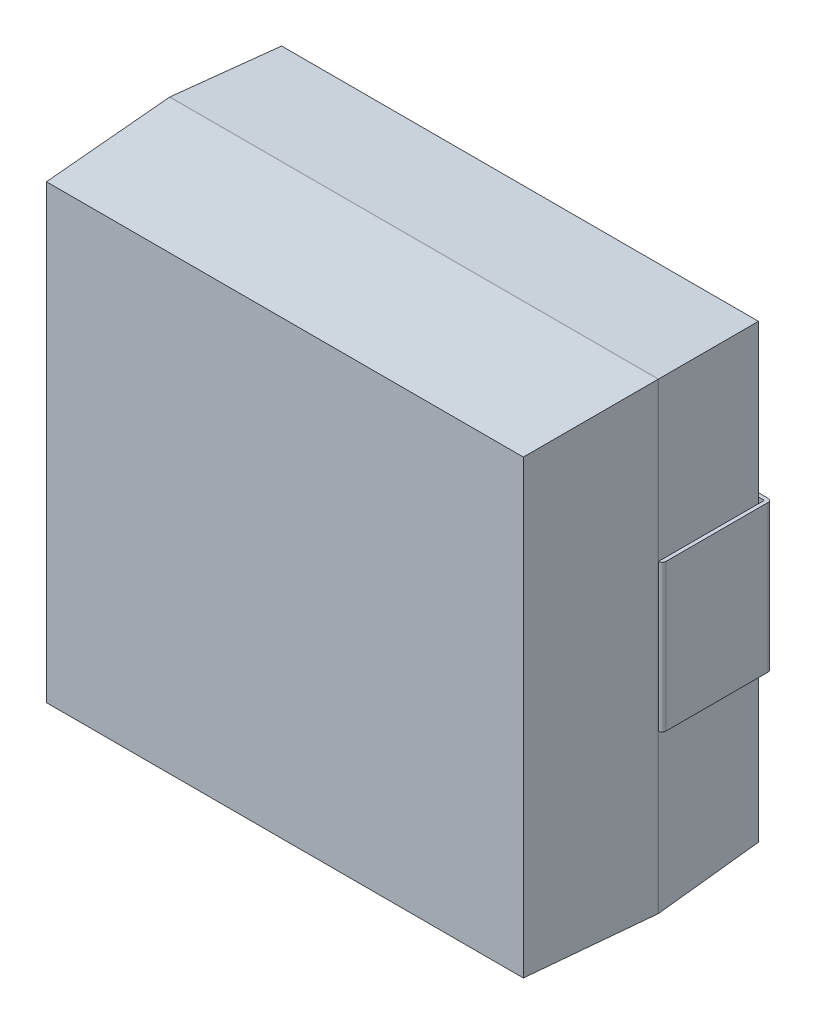
ISO-10303-21;
HEADER;
FILE_DESCRIPTION(('STEP AP214'),'2;1');
FILE_NAME('part.step','',(''),(''),'','','');
FILE_SCHEMA(('AUTOMOTIVE_DESIGN { 1 0 10303 214 1 1 1 1 }'));
ENDSEC;
DATA;
#1=APPLICATION_CONTEXT('core data for automotive mechanical design processes');
#2=APPLICATION_PROTOCOL_DEFINITION('international standard','automotive_design',2000,#1);
#3=PRODUCT_CONTEXT('',#1,'mechanical');
#4=PRODUCT('Part','Part','',(#3));
#5=PRODUCT_RELATED_PRODUCT_CATEGORY('part','',(#4));
#6=PRODUCT_DEFINITION_FORMATION('','',#4);
#7=PRODUCT_DEFINITION_CONTEXT('part definition',#1,'design');
#8=PRODUCT_DEFINITION('design','',#6,#7);
#9=PRODUCT_DEFINITION_SHAPE('','',#8);
#10=(LENGTH_UNIT() NAMED_UNIT(*) SI_UNIT(.MILLI.,.METRE.));
#11=(NAMED_UNIT(*) PLANE_ANGLE_UNIT() SI_UNIT($,.RADIAN.));
#12=(NAMED_UNIT(*) SI_UNIT($,.STERADIAN.) SOLID_ANGLE_UNIT());
#13=UNCERTAINTY_MEASURE_WITH_UNIT(LENGTH_MEASURE(1.E-05),#10,'distance_accuracy_value','');
#14=(GEOMETRIC_REPRESENTATION_CONTEXT(3) GLOBAL_UNCERTAINTY_ASSIGNED_CONTEXT((#13)) GLOBAL_UNIT_ASSIGNED_CONTEXT((#10,
#11,#12)) REPRESENTATION_CONTEXT('',''));
#15=CARTESIAN_POINT('',(0.,0.,0.));
#16=DIRECTION('',(0.,0.,1.));
#17=DIRECTION('',(1.,0.,0.));
#18=AXIS2_PLACEMENT_3D('',#15,#16,#17);
#19=CARTESIAN_POINT('',(-6.65,-6.3,0.1));
#20=DIRECTION('',(1.,0.,0.));
#21=DIRECTION('',(0.,1.,0.));
#22=AXIS2_PLACEMENT_3D('',#19,#20,#21);
#23=PLANE('',#22);
#24=DIRECTION('',(0.,1.,0.));
#25=VECTOR('',#24,1.);
#26=CARTESIAN_POINT('',(-6.65,-6.3,2.99));
#27=LINE('',#26,#25);
#28=CARTESIAN_POINT('',(-6.65,-6.3,2.99));
#29=VERTEX_POINT('',#28);
#30=CARTESIAN_POINT('',(-6.65,6.3,2.99));
#31=VERTEX_POINT('',#30);
#32=EDGE_CURVE('P0_E105',#29,#31,#27,.T.);
#33=ORIENTED_EDGE('',*,*,#32,.T.);
#34=DIRECTION('',(0.,0.,1.));
#35=VECTOR('',#34,1.);
#36=CARTESIAN_POINT('',(-6.65,6.3,0.1));
#37=LINE('',#36,#35);
#38=CARTESIAN_POINT('',(-6.65,6.3,2.98));
#39=VERTEX_POINT('',#38);
#40=EDGE_CURVE('P0_E164',#39,#31,#37,.T.);
#41=ORIENTED_EDGE('',*,*,#40,.F.);
#42=DIRECTION('',(0.,1.,0.));
#43=VECTOR('',#42,1.);
#44=CARTESIAN_POINT('',(-6.65,-6.3,2.98));
#45=LINE('',#44,#43);
#46=CARTESIAN_POINT('',(-6.65,-6.3,2.98));
#47=VERTEX_POINT('',#46);
#48=EDGE_CURVE('P0_E28',#47,#39,#45,.T.);
#49=ORIENTED_EDGE('',*,*,#48,.F.);
#50=DIRECTION('',(0.,0.,1.));
#51=VECTOR('',#50,1.);
#52=CARTESIAN_POINT('',(-6.65,-6.3,0.1));
#53=LINE('',#52,#51);
#54=EDGE_CURVE('P0_E11',#47,#29,#53,.T.);
#55=ORIENTED_EDGE('',*,*,#54,.T.);
#56=EDGE_LOOP('',(#33,#41,#49,#55));
#57=FACE_BOUND('',#56,.T.);
#58=ADVANCED_FACE('P0_F17',(#57),#23,.F.);
#59=CARTESIAN_POINT('',(-6.65,-6.3,0.1));
#60=DIRECTION('',(0.,1.,0.));
#61=DIRECTION('',(1.,0.,0.));
#62=AXIS2_PLACEMENT_3D('',#59,#60,#61);
#63=PLANE('',#62);
#64=DIRECTION('',(1.,0.,0.));
#65=VECTOR('',#64,1.);
#66=CARTESIAN_POINT('',(-6.65,-6.3,2.99));
#67=LINE('',#66,#65);
#68=CARTESIAN_POINT('',(6.65,-6.3,2.99));
#69=VERTEX_POINT('',#68);
#70=EDGE_CURVE('P0_E109',#29,#69,#67,.T.);
#71=ORIENTED_EDGE('',*,*,#70,.F.);
#72=ORIENTED_EDGE('',*,*,#54,.F.);
#73=DIRECTION('',(1.,0.,0.));
#74=VECTOR('',#73,1.);
#75=CARTESIAN_POINT('',(-6.65,-6.3,2.98));
#76=LINE('',#75,#74);
#77=CARTESIAN_POINT('',(6.65,-6.3,2.98));
#78=VERTEX_POINT('',#77);
#79=EDGE_CURVE('P0_E161',#47,#78,#76,.T.);
#80=ORIENTED_EDGE('',*,*,#79,.T.);
#81=DIRECTION('',(0.,0.,1.));
#82=VECTOR('',#81,1.);
#83=CARTESIAN_POINT('',(6.65,-6.3,0.1));
#84=LINE('',#83,#82);
#85=EDGE_CURVE('P0_E140',#78,#69,#84,.T.);
#86=ORIENTED_EDGE('',*,*,#85,.T.);
#87=EDGE_LOOP('',(#71,#72,#80,#86));
#88=FACE_BOUND('',#87,.T.);
#89=ADVANCED_FACE('P0_F234',(#88),#63,.F.);
#90=CARTESIAN_POINT('',(-6.57,-6.3,1.54));
#91=DIRECTION('',(-0.99846035320541,0.,-0.0554700196225628));
#92=DIRECTION('',(-0.0554700196225628,0.,0.99846035320541));
#93=AXIS2_PLACEMENT_3D('',#90,#91,#92);
#94=PLANE('',#93);
#95=DIRECTION('',(0.0553848775621744,0.0553848775621744,-0.99692779611908));
#96=VECTOR('',#95,1.);
#97=CARTESIAN_POINT('',(-6.570245398773,-6.220245398773,1.544417177914));
#98=LINE('',#97,#96);
#99=CARTESIAN_POINT('',(-6.49,-6.14,0.1));
#100=VERTEX_POINT('',#99);
#101=EDGE_CURVE('P0_E136',#47,#100,#98,.T.);
#102=ORIENTED_EDGE('',*,*,#101,.F.);
#103=ORIENTED_EDGE('',*,*,#48,.T.);
#104=DIRECTION('',(0.0553848775621744,-0.0553848775621744,-0.99692779611908));
#105=VECTOR('',#104,1.);
#106=CARTESIAN_POINT('',(-6.550920245399,6.200920245399,1.196564417178));
#107=LINE('',#106,#105);
#108=CARTESIAN_POINT('',(-6.49,6.14,0.1));
#109=VERTEX_POINT('',#108);
#110=EDGE_CURVE('P0_E120',#39,#109,#107,.T.);
#111=ORIENTED_EDGE('',*,*,#110,.T.);
#112=DIRECTION('',(0.,1.,0.));
#113=VECTOR('',#112,1.);
#114=CARTESIAN_POINT('',(-6.49,-6.3,0.1));
#115=LINE('',#114,#113);
#116=EDGE_CURVE('P0_E110',#100,#109,#115,.T.);
#117=ORIENTED_EDGE('',*,*,#116,.F.);
#118=EDGE_LOOP('',(#102,#103,#111,#117));
#119=FACE_BOUND('',#118,.T.);
#120=ADVANCED_FACE('P0_F236',(#119),#94,.T.);
#121=CARTESIAN_POINT('',(-6.57,-6.3,4.745));
#122=DIRECTION('',(0.998962663729287,0.,-0.0455367596002231));
#123=DIRECTION('',(0.,-1.,0.));
#124=AXIS2_PLACEMENT_3D('',#121,#122,#123);
#125=PLANE('',#124);
#126=DIRECTION('',(0.,1.,0.));
#127=VECTOR('',#126,1.);
#128=CARTESIAN_POINT('',(-6.49,-6.3,6.5));
#129=LINE('',#128,#127);
#130=CARTESIAN_POINT('',(-6.49,-6.14,6.5));
#131=VERTEX_POINT('',#130);
#132=CARTESIAN_POINT('',(-6.49,6.14,6.5));
#133=VERTEX_POINT('',#132);
#134=EDGE_CURVE('P0_E103',#131,#133,#129,.T.);
#135=ORIENTED_EDGE('',*,*,#134,.T.);
#136=DIRECTION('',(0.045489620466118,-0.045489620466118,0.997928548975174));
#137=VECTOR('',#136,1.);
#138=CARTESIAN_POINT('',(-6.557128919354,6.207128919354,5.027359331679));
#139=LINE('',#138,#137);
#140=EDGE_CURVE('P0_E126',#31,#133,#139,.T.);
#141=ORIENTED_EDGE('',*,*,#140,.F.);
#142=ORIENTED_EDGE('',*,*,#32,.F.);
#143=DIRECTION('',(0.045489620466118,0.045489620466118,0.997928548975174));
#144=VECTOR('',#143,1.);
#145=CARTESIAN_POINT('',(-6.570165544446,-6.220165544446,4.741368368724));
#146=LINE('',#145,#144);
#147=EDGE_CURVE('P0_E21',#29,#131,#146,.T.);
#148=ORIENTED_EDGE('',*,*,#147,.T.);
#149=EDGE_LOOP('',(#135,#141,#142,#148));
#150=FACE_BOUND('',#149,.T.);
#151=ADVANCED_FACE('P0_F100',(#150),#125,.F.);
#152=CARTESIAN_POINT('',(-6.65,6.3,0.1));
#153=DIRECTION('',(0.,1.,0.));
#154=DIRECTION('',(1.,0.,0.));
#155=AXIS2_PLACEMENT_3D('',#152,#153,#154);
#156=PLANE('',#155);
#157=DIRECTION('',(0.,0.,1.));
#158=VECTOR('',#157,1.);
#159=CARTESIAN_POINT('',(6.65,6.3,0.1));
#160=LINE('',#159,#158);
#161=CARTESIAN_POINT('',(6.65,6.3,2.98));
#162=VERTEX_POINT('',#161);
#163=CARTESIAN_POINT('',(6.65,6.3,2.99));
#164=VERTEX_POINT('',#163);
#165=EDGE_CURVE('P0_E143',#162,#164,#160,.T.);
#166=ORIENTED_EDGE('',*,*,#165,.F.);
#167=DIRECTION('',(1.,0.,0.));
#168=VECTOR('',#167,1.);
#169=CARTESIAN_POINT('',(-6.65,6.3,2.98));
#170=LINE('',#169,#168);
#171=EDGE_CURVE('P0_E155',#39,#162,#170,.T.);
#172=ORIENTED_EDGE('',*,*,#171,.F.);
#173=ORIENTED_EDGE('',*,*,#40,.T.);
#174=DIRECTION('',(1.,0.,0.));
#175=VECTOR('',#174,1.);
#176=CARTESIAN_POINT('',(-6.65,6.3,2.99));
#177=LINE('',#176,#175);
#178=EDGE_CURVE('P0_E132',#31,#164,#177,.T.);
#179=ORIENTED_EDGE('',*,*,#178,.T.);
#180=EDGE_LOOP('',(#166,#172,#173,#179));
#181=FACE_BOUND('',#180,.T.);
#182=ADVANCED_FACE('P0_F323',(#181),#156,.T.);
#183=CARTESIAN_POINT('',(6.65,-6.3,0.1));
#184=DIRECTION('',(1.,0.,0.));
#185=DIRECTION('',(0.,1.,0.));
#186=AXIS2_PLACEMENT_3D('',#183,#184,#185);
#187=PLANE('',#186);
#188=ORIENTED_EDGE('',*,*,#85,.F.);
#189=DIRECTION('',(0.,1.,0.));
#190=VECTOR('',#189,1.);
#191=CARTESIAN_POINT('',(6.65,-6.3,2.98));
#192=LINE('',#191,#190);
#193=EDGE_CURVE('P0_E171',#78,#162,#192,.T.);
#194=ORIENTED_EDGE('',*,*,#193,.T.);
#195=ORIENTED_EDGE('',*,*,#165,.T.);
#196=DIRECTION('',(0.,1.,0.));
#197=VECTOR('',#196,1.);
#198=CARTESIAN_POINT('',(6.65,-6.3,2.99));
#199=LINE('',#198,#197);
#200=EDGE_CURVE('P0_E139',#69,#164,#199,.T.);
#201=ORIENTED_EDGE('',*,*,#200,.F.);
#202=EDGE_LOOP('',(#188,#194,#195,#201));
#203=FACE_BOUND('',#202,.T.);
#204=ADVANCED_FACE('P0_F232',(#203),#187,.T.);
#205=CARTESIAN_POINT('',(-6.65,-6.22,1.54));
#206=DIRECTION('',(0.,-0.99846035320541,-0.0554700196225628));
#207=DIRECTION('',(0.,0.0554700196225628,-0.99846035320541));
#208=AXIS2_PLACEMENT_3D('',#205,#206,#207);
#209=PLANE('',#208);
#210=DIRECTION('',(1.,0.,0.));
#211=VECTOR('',#210,1.);
#212=CARTESIAN_POINT('',(-6.65,-6.14,0.1));
#213=LINE('',#212,#211);
#214=CARTESIAN_POINT('',(6.49,-6.14,0.1));
#215=VERTEX_POINT('',#214);
#216=EDGE_CURVE('P0_E146',#100,#215,#213,.T.);
#217=ORIENTED_EDGE('',*,*,#216,.T.);
#218=DIRECTION('',(-0.0553848775621744,0.0553848775621744,-0.99692779611908));
#219=VECTOR('',#218,1.);
#220=CARTESIAN_POINT('',(6.549846625767,-6.199846625767,1.177239263804));
#221=LINE('',#220,#219);
#222=EDGE_CURVE('P0_E175',#78,#215,#221,.T.);
#223=ORIENTED_EDGE('',*,*,#222,.F.);
#224=ORIENTED_EDGE('',*,*,#79,.F.);
#225=ORIENTED_EDGE('',*,*,#101,.T.);
#226=EDGE_LOOP('',(#217,#223,#224,#225));
#227=FACE_BOUND('',#226,.T.);
#228=ADVANCED_FACE('P0_F218',(#227),#209,.T.);
#229=CARTESIAN_POINT('',(-6.65,-6.22,4.745));
#230=DIRECTION('',(0.,0.998962663729287,-0.0455367596002231));
#231=DIRECTION('',(-1.,0.,0.));
#232=AXIS2_PLACEMENT_3D('',#229,#230,#231);
#233=PLANE('',#232);
#234=ORIENTED_EDGE('',*,*,#147,.F.);
#235=ORIENTED_EDGE('',*,*,#70,.T.);
#236=DIRECTION('',(-0.045489620466118,0.045489620466118,0.997928548975174));
#237=VECTOR('',#236,1.);
#238=CARTESIAN_POINT('',(6.556404662404,-6.206404662404,5.04324771851));
#239=LINE('',#238,#237);
#240=CARTESIAN_POINT('',(6.49,-6.14,6.5));
#241=VERTEX_POINT('',#240);
#242=EDGE_CURVE('P0_E115',#69,#241,#239,.T.);
#243=ORIENTED_EDGE('',*,*,#242,.T.);
#244=DIRECTION('',(1.,0.,0.));
#245=VECTOR('',#244,1.);
#246=CARTESIAN_POINT('',(-6.65,-6.14,6.5));
#247=LINE('',#246,#245);
#248=EDGE_CURVE('P0_E112',#131,#241,#247,.T.);
#249=ORIENTED_EDGE('',*,*,#248,.F.);
#250=EDGE_LOOP('',(#234,#235,#243,#249));
#251=FACE_BOUND('',#250,.T.);
#252=ADVANCED_FACE('P0_F113',(#251),#233,.F.);
#253=CARTESIAN_POINT('',(-6.65,-6.3,0.1));
#254=DIRECTION('',(0.,0.,1.));
#255=DIRECTION('',(1.,0.,0.));
#256=AXIS2_PLACEMENT_3D('',#253,#254,#255);
#257=PLANE('',#256);
#258=DIRECTION('',(1.,0.,0.));
#259=VECTOR('',#258,1.);
#260=CARTESIAN_POINT('',(-6.65,6.14,0.1));
#261=LINE('',#260,#259);
#262=CARTESIAN_POINT('',(6.49,6.14,0.1));
#263=VERTEX_POINT('',#262);
#264=EDGE_CURVE('P0_E152',#109,#263,#261,.T.);
#265=ORIENTED_EDGE('',*,*,#264,.T.);
#266=DIRECTION('',(0.,1.,0.));
#267=VECTOR('',#266,1.);
#268=CARTESIAN_POINT('',(6.49,-6.3,0.1));
#269=LINE('',#268,#267);
#270=EDGE_CURVE('P0_E158',#215,#263,#269,.T.);
#271=ORIENTED_EDGE('',*,*,#270,.F.);
#272=ORIENTED_EDGE('',*,*,#216,.F.);
#273=ORIENTED_EDGE('',*,*,#116,.T.);
#274=EDGE_LOOP('',(#265,#271,#272,#273));
#275=FACE_BOUND('',#274,.T.);
#276=ADVANCED_FACE('P0_F19',(#275),#257,.F.);
#277=CARTESIAN_POINT('',(-6.65,6.22,1.54));
#278=DIRECTION('',(0.,-0.99846035320541,0.0554700196225628));
#279=DIRECTION('',(-1.,0.,0.));
#280=AXIS2_PLACEMENT_3D('',#277,#278,#279);
#281=PLANE('',#280);
#282=ORIENTED_EDGE('',*,*,#110,.F.);
#283=ORIENTED_EDGE('',*,*,#171,.T.);
#284=DIRECTION('',(-0.0553848775621744,-0.0553848775621744,-0.99692779611908));
#285=VECTOR('',#284,1.);
#286=CARTESIAN_POINT('',(6.530521472393,6.180521472393,0.829386503067));
#287=LINE('',#286,#285);
#288=EDGE_CURVE('P0_E168',#162,#263,#287,.T.);
#289=ORIENTED_EDGE('',*,*,#288,.T.);
#290=ORIENTED_EDGE('',*,*,#264,.F.);
#291=EDGE_LOOP('',(#282,#283,#289,#290));
#292=FACE_BOUND('',#291,.T.);
#293=ADVANCED_FACE('P0_F228',(#292),#281,.F.);
#294=CARTESIAN_POINT('',(-6.65,-6.3,6.5));
#295=DIRECTION('',(0.,0.,1.));
#296=DIRECTION('',(1.,0.,0.));
#297=AXIS2_PLACEMENT_3D('',#294,#295,#296);
#298=PLANE('',#297);
#299=ORIENTED_EDGE('',*,*,#134,.F.);
#300=ORIENTED_EDGE('',*,*,#248,.T.);
#301=DIRECTION('',(0.,1.,0.));
#302=VECTOR('',#301,1.);
#303=CARTESIAN_POINT('',(6.49,-6.3,6.5));
#304=LINE('',#303,#302);
#305=CARTESIAN_POINT('',(6.49,6.14,6.5));
#306=VERTEX_POINT('',#305);
#307=EDGE_CURVE('P0_E151',#241,#306,#304,.T.);
#308=ORIENTED_EDGE('',*,*,#307,.T.);
#309=DIRECTION('',(1.,0.,0.));
#310=VECTOR('',#309,1.);
#311=CARTESIAN_POINT('',(-6.65,6.14,6.5));
#312=LINE('',#311,#310);
#313=EDGE_CURVE('P0_E124',#133,#306,#312,.T.);
#314=ORIENTED_EDGE('',*,*,#313,.F.);
#315=EDGE_LOOP('',(#299,#300,#308,#314));
#316=FACE_BOUND('',#315,.T.);
#317=ADVANCED_FACE('P0_F123',(#316),#298,.T.);
#318=CARTESIAN_POINT('',(-6.65,6.22,4.745));
#319=DIRECTION('',(0.,0.998962663729287,0.0455367596002231));
#320=DIRECTION('',(1.,0.,0.));
#321=AXIS2_PLACEMENT_3D('',#318,#319,#320);
#322=PLANE('',#321);
#323=ORIENTED_EDGE('',*,*,#313,.T.);
#324=DIRECTION('',(-0.045489620466118,-0.045489620466118,0.997928548975174));
#325=VECTOR('',#324,1.);
#326=CARTESIAN_POINT('',(6.543368037312,6.193368037312,5.329238681464));
#327=LINE('',#326,#325);
#328=EDGE_CURVE('P0_E147',#164,#306,#327,.T.);
#329=ORIENTED_EDGE('',*,*,#328,.F.);
#330=ORIENTED_EDGE('',*,*,#178,.F.);
#331=ORIENTED_EDGE('',*,*,#140,.T.);
#332=EDGE_LOOP('',(#323,#329,#330,#331));
#333=FACE_BOUND('',#332,.T.);
#334=ADVANCED_FACE('P0_F249',(#333),#322,.T.);
#335=CARTESIAN_POINT('',(6.57,-6.3,1.54));
#336=DIRECTION('',(-0.99846035320541,0.,0.0554700196225628));
#337=DIRECTION('',(0.,1.,0.));
#338=AXIS2_PLACEMENT_3D('',#335,#336,#337);
#339=PLANE('',#338);
#340=ORIENTED_EDGE('',*,*,#270,.T.);
#341=ORIENTED_EDGE('',*,*,#288,.F.);
#342=ORIENTED_EDGE('',*,*,#193,.F.);
#343=ORIENTED_EDGE('',*,*,#222,.T.);
#344=EDGE_LOOP('',(#340,#341,#342,#343));
#345=FACE_BOUND('',#344,.T.);
#346=ADVANCED_FACE('P0_F225',(#345),#339,.F.);
#347=CARTESIAN_POINT('',(6.57,-6.3,4.745));
#348=DIRECTION('',(0.998962663729287,0.,0.0455367596002231));
#349=DIRECTION('',(0.,-1.,0.));
#350=AXIS2_PLACEMENT_3D('',#347,#348,#349);
#351=PLANE('',#350);
#352=ORIENTED_EDGE('',*,*,#242,.F.);
#353=ORIENTED_EDGE('',*,*,#200,.T.);
#354=ORIENTED_EDGE('',*,*,#328,.T.);
#355=ORIENTED_EDGE('',*,*,#307,.F.);
#356=EDGE_LOOP('',(#352,#353,#354,#355));
#357=FACE_BOUND('',#356,.T.);
#358=ADVANCED_FACE('P0_F255',(#357),#351,.T.);
#359=CLOSED_SHELL('',(#58,#89,#120,#151,#182,#204,#228,#252,#276,#293,#317,#334,#346,#358));
#360=MANIFOLD_SOLID_BREP('P0_B1',#359);
#361=CARTESIAN_POINT('',(-5.886090225564,-2.,1.471954887218));
#362=DIRECTION('',(0.,-1.,0.));
#363=DIRECTION('',(0.,0.,-1.));
#364=AXIS2_PLACEMENT_3D('',#361,#362,#363);
#365=PLANE('',#364);
#366=DIRECTION('',(1.,0.,0.));
#367=VECTOR('',#366,1.);
#368=CARTESIAN_POINT('',(-6.75,-2.,2.98));
#369=LINE('',#368,#367);
#370=CARTESIAN_POINT('',(-6.65,-2.,2.98));
#371=VERTEX_POINT('',#370);
#372=CARTESIAN_POINT('',(-4.25,-2.,2.98));
#373=VERTEX_POINT('',#372);
#374=EDGE_CURVE('P1_E11',#371,#373,#369,.T.);
#375=ORIENTED_EDGE('',*,*,#374,.F.);
#376=CARTESIAN_POINT('',(-6.65,-2.,2.88));
#377=DIRECTION('',(0.,-1.,0.));
#378=DIRECTION('',(0.,0.,1.));
#379=AXIS2_PLACEMENT_3D('',#376,#377,#378);
#380=CIRCLE('',#379,0.1);
#381=CARTESIAN_POINT('',(-6.75,-2.,2.88));
#382=VERTEX_POINT('',#381);
#383=EDGE_CURVE('P1_E27',#371,#382,#380,.T.);
#384=ORIENTED_EDGE('',*,*,#383,.T.);
#385=DIRECTION('',(0.,0.,1.));
#386=VECTOR('',#385,1.);
#387=CARTESIAN_POINT('',(-6.75,-2.,0.));
#388=LINE('',#387,#386);
#389=CARTESIAN_POINT('',(-6.75,-2.,0.1));
#390=VERTEX_POINT('',#389);
#391=EDGE_CURVE('P1_E139',#390,#382,#388,.T.);
#392=ORIENTED_EDGE('',*,*,#391,.F.);
#393=CARTESIAN_POINT('',(-6.65,-2.,0.1));
#394=DIRECTION('',(0.,-1.,0.));
#395=DIRECTION('',(0.,0.,1.));
#396=AXIS2_PLACEMENT_3D('',#393,#394,#395);
#397=CIRCLE('',#396,0.1);
#398=CARTESIAN_POINT('',(-6.65,-2.,0.));
#399=VERTEX_POINT('',#398);
#400=EDGE_CURVE('P1_E129',#390,#399,#397,.T.);
#401=ORIENTED_EDGE('',*,*,#400,.T.);
#402=DIRECTION('',(1.,0.,0.));
#403=VECTOR('',#402,1.);
#404=CARTESIAN_POINT('',(-6.75,-2.,0.));
#405=LINE('',#404,#403);
#406=CARTESIAN_POINT('',(-4.15,-2.,0.));
#407=VERTEX_POINT('',#406);
#408=EDGE_CURVE('P1_E202',#399,#407,#405,.T.);
#409=ORIENTED_EDGE('',*,*,#408,.T.);
#410=DIRECTION('',(0.,0.,1.));
#411=VECTOR('',#410,1.);
#412=CARTESIAN_POINT('',(-4.15,-2.,0.));
#413=LINE('',#412,#411);
#414=CARTESIAN_POINT('',(-4.15,-2.,0.1));
#415=VERTEX_POINT('',#414);
#416=EDGE_CURVE('P1_E187',#407,#415,#413,.T.);
#417=ORIENTED_EDGE('',*,*,#416,.T.);
#418=DIRECTION('',(1.,0.,0.));
#419=VECTOR('',#418,1.);
#420=CARTESIAN_POINT('',(-6.75,-2.,0.1));
#421=LINE('',#420,#419);
#422=CARTESIAN_POINT('',(-6.65,-2.,0.1));
#423=VERTEX_POINT('',#422);
#424=EDGE_CURVE('P1_E193',#423,#415,#421,.T.);
#425=ORIENTED_EDGE('',*,*,#424,.F.);
#426=DIRECTION('',(0.,0.,1.));
#427=VECTOR('',#426,1.);
#428=CARTESIAN_POINT('',(-6.65,-2.,0.));
#429=LINE('',#428,#427);
#430=CARTESIAN_POINT('',(-6.65,-2.,2.88));
#431=VERTEX_POINT('',#430);
#432=EDGE_CURVE('P1_E211',#423,#431,#429,.T.);
#433=ORIENTED_EDGE('',*,*,#432,.T.);
#434=DIRECTION('',(1.,0.,0.));
#435=VECTOR('',#434,1.);
#436=CARTESIAN_POINT('',(-6.75,-2.,2.88));
#437=LINE('',#436,#435);
#438=CARTESIAN_POINT('',(-4.25,-2.,2.88));
#439=VERTEX_POINT('',#438);
#440=EDGE_CURVE('P1_E135',#431,#439,#437,.T.);
#441=ORIENTED_EDGE('',*,*,#440,.T.);
#442=DIRECTION('',(0.,0.,1.));
#443=VECTOR('',#442,1.);
#444=CARTESIAN_POINT('',(-4.25,-2.,2.88));
#445=LINE('',#444,#443);
#446=EDGE_CURVE('P1_E144',#439,#373,#445,.T.);
#447=ORIENTED_EDGE('',*,*,#446,.T.);
#448=EDGE_LOOP('',(#375,#384,#392,#401,#409,#417,#425,#433,#441,#447));
#449=FACE_BOUND('',#448,.T.);
#450=ADVANCED_FACE('P1_F17',(#449),#365,.T.);
#451=CARTESIAN_POINT('',(-6.75,-2.,2.98));
#452=DIRECTION('',(0.,0.,1.));
#453=DIRECTION('',(1.,0.,0.));
#454=AXIS2_PLACEMENT_3D('',#451,#452,#453);
#455=PLANE('',#454);
#456=DIRECTION('',(1.,0.,0.));
#457=VECTOR('',#456,1.);
#458=CARTESIAN_POINT('',(-6.75,2.,2.98));
#459=LINE('',#458,#457);
#460=CARTESIAN_POINT('',(-6.65,2.,2.98));
#461=VERTEX_POINT('',#460);
#462=CARTESIAN_POINT('',(-4.25,2.,2.98));
#463=VERTEX_POINT('',#462);
#464=EDGE_CURVE('P1_E168',#461,#463,#459,.T.);
#465=ORIENTED_EDGE('',*,*,#464,.F.);
#466=DIRECTION('',(0.,1.,0.));
#467=VECTOR('',#466,1.);
#468=CARTESIAN_POINT('',(-6.65,-2.,2.98));
#469=LINE('',#468,#467);
#470=EDGE_CURVE('P1_E164',#371,#461,#469,.T.);
#471=ORIENTED_EDGE('',*,*,#470,.F.);
#472=ORIENTED_EDGE('',*,*,#374,.T.);
#473=DIRECTION('',(0.,1.,0.));
#474=VECTOR('',#473,1.);
#475=CARTESIAN_POINT('',(-4.25,-2.,2.98));
#476=LINE('',#475,#474);
#477=EDGE_CURVE('P1_E106',#373,#463,#476,.T.);
#478=ORIENTED_EDGE('',*,*,#477,.T.);
#479=EDGE_LOOP('',(#465,#471,#472,#478));
#480=FACE_BOUND('',#479,.T.);
#481=ADVANCED_FACE('P1_F374',(#480),#455,.T.);
#482=CARTESIAN_POINT('',(-6.65,-2.,2.88));
#483=DIRECTION('',(0.,1.,0.));
#484=DIRECTION('',(0.,0.,1.));
#485=AXIS2_PLACEMENT_3D('',#482,#483,#484);
#486=CYLINDRICAL_SURFACE('',#485,0.1);
#487=ORIENTED_EDGE('',*,*,#470,.T.);
#488=CARTESIAN_POINT('',(-6.65,2.,2.88));
#489=DIRECTION('',(0.,-1.,0.));
#490=DIRECTION('',(0.,0.,1.));
#491=AXIS2_PLACEMENT_3D('',#488,#489,#490);
#492=CIRCLE('',#491,0.1);
#493=CARTESIAN_POINT('',(-6.75,2.,2.88));
#494=VERTEX_POINT('',#493);
#495=EDGE_CURVE('P1_E161',#461,#494,#492,.T.);
#496=ORIENTED_EDGE('',*,*,#495,.T.);
#497=DIRECTION('',(0.,1.,0.));
#498=VECTOR('',#497,1.);
#499=CARTESIAN_POINT('',(-6.75,-2.,2.88));
#500=LINE('',#499,#498);
#501=EDGE_CURVE('P1_E150',#382,#494,#500,.T.);
#502=ORIENTED_EDGE('',*,*,#501,.F.);
#503=ORIENTED_EDGE('',*,*,#383,.F.);
#504=EDGE_LOOP('',(#487,#496,#502,#503));
#505=FACE_BOUND('',#504,.T.);
#506=ADVANCED_FACE('P1_F162',(#505),#486,.T.);
#507=CARTESIAN_POINT('',(-4.25,-2.,2.88));
#508=DIRECTION('',(1.,0.,0.));
#509=DIRECTION('',(0.,1.,0.));
#510=AXIS2_PLACEMENT_3D('',#507,#508,#509);
#511=PLANE('',#510);
#512=ORIENTED_EDGE('',*,*,#446,.F.);
#513=DIRECTION('',(0.,1.,0.));
#514=VECTOR('',#513,1.);
#515=CARTESIAN_POINT('',(-4.25,-2.,2.88));
#516=LINE('',#515,#514);
#517=CARTESIAN_POINT('',(-4.25,2.,2.88));
#518=VERTEX_POINT('',#517);
#519=EDGE_CURVE('P1_E92',#439,#518,#516,.T.);
#520=ORIENTED_EDGE('',*,*,#519,.T.);
#521=DIRECTION('',(0.,0.,1.));
#522=VECTOR('',#521,1.);
#523=CARTESIAN_POINT('',(-4.25,2.,2.88));
#524=LINE('',#523,#522);
#525=EDGE_CURVE('P1_E183',#518,#463,#524,.T.);
#526=ORIENTED_EDGE('',*,*,#525,.T.);
#527=ORIENTED_EDGE('',*,*,#477,.F.);
#528=EDGE_LOOP('',(#512,#520,#526,#527));
#529=FACE_BOUND('',#528,.T.);
#530=ADVANCED_FACE('P1_F373',(#529),#511,.T.);
#531=CARTESIAN_POINT('',(-6.75,-2.,0.));
#532=DIRECTION('',(1.,0.,0.));
#533=DIRECTION('',(0.,1.,0.));
#534=AXIS2_PLACEMENT_3D('',#531,#532,#533);
#535=PLANE('',#534);
#536=ORIENTED_EDGE('',*,*,#501,.T.);
#537=DIRECTION('',(0.,0.,1.));
#538=VECTOR('',#537,1.);
#539=CARTESIAN_POINT('',(-6.75,2.,0.));
#540=LINE('',#539,#538);
#541=CARTESIAN_POINT('',(-6.75,2.,0.1));
#542=VERTEX_POINT('',#541);
#543=EDGE_CURVE('P1_E155',#542,#494,#540,.T.);
#544=ORIENTED_EDGE('',*,*,#543,.F.);
#545=DIRECTION('',(0.,1.,0.));
#546=VECTOR('',#545,1.);
#547=CARTESIAN_POINT('',(-6.75,-2.,0.1));
#548=LINE('',#547,#546);
#549=EDGE_CURVE('P1_E20',#390,#542,#548,.T.);
#550=ORIENTED_EDGE('',*,*,#549,.F.);
#551=ORIENTED_EDGE('',*,*,#391,.T.);
#552=EDGE_LOOP('',(#536,#544,#550,#551));
#553=FACE_BOUND('',#552,.T.);
#554=ADVANCED_FACE('P1_F152',(#553),#535,.F.);
#555=CARTESIAN_POINT('',(-6.75,-2.,2.88));
#556=DIRECTION('',(0.,0.,1.));
#557=DIRECTION('',(1.,0.,0.));
#558=AXIS2_PLACEMENT_3D('',#555,#556,#557);
#559=PLANE('',#558);
#560=ORIENTED_EDGE('',*,*,#519,.F.);
#561=ORIENTED_EDGE('',*,*,#440,.F.);
#562=DIRECTION('',(0.,1.,0.));
#563=VECTOR('',#562,1.);
#564=CARTESIAN_POINT('',(-6.65,-2.,2.88));
#565=LINE('',#564,#563);
#566=CARTESIAN_POINT('',(-6.65,2.,2.88));
#567=VERTEX_POINT('',#566);
#568=EDGE_CURVE('P1_E222',#431,#567,#565,.T.);
#569=ORIENTED_EDGE('',*,*,#568,.T.);
#570=DIRECTION('',(1.,0.,0.));
#571=VECTOR('',#570,1.);
#572=CARTESIAN_POINT('',(-6.75,2.,2.88));
#573=LINE('',#572,#571);
#574=EDGE_CURVE('P1_E199',#567,#518,#573,.T.);
#575=ORIENTED_EDGE('',*,*,#574,.T.);
#576=EDGE_LOOP('',(#560,#561,#569,#575));
#577=FACE_BOUND('',#576,.T.);
#578=ADVANCED_FACE('P1_F266',(#577),#559,.F.);
#579=CARTESIAN_POINT('',(-6.65,-2.,0.1));
#580=DIRECTION('',(0.,1.,0.));
#581=DIRECTION('',(-1.,0.,0.));
#582=AXIS2_PLACEMENT_3D('',#579,#580,#581);
#583=CYLINDRICAL_SURFACE('',#582,0.1);
#584=ORIENTED_EDGE('',*,*,#549,.T.);
#585=CARTESIAN_POINT('',(-6.65,2.,0.1));
#586=DIRECTION('',(0.,-1.,0.));
#587=DIRECTION('',(0.,0.,1.));
#588=AXIS2_PLACEMENT_3D('',#585,#586,#587);
#589=CIRCLE('',#588,0.1);
#590=CARTESIAN_POINT('',(-6.65,2.,0.));
#591=VERTEX_POINT('',#590);
#592=EDGE_CURVE('P1_E172',#542,#591,#589,.T.);
#593=ORIENTED_EDGE('',*,*,#592,.T.);
#594=DIRECTION('',(0.,1.,0.));
#595=VECTOR('',#594,1.);
#596=CARTESIAN_POINT('',(-6.65,-2.,0.));
#597=LINE('',#596,#595);
#598=EDGE_CURVE('P1_E61',#399,#591,#597,.T.);
#599=ORIENTED_EDGE('',*,*,#598,.F.);
#600=ORIENTED_EDGE('',*,*,#400,.F.);
#601=EDGE_LOOP('',(#584,#593,#599,#600));
#602=FACE_BOUND('',#601,.T.);
#603=ADVANCED_FACE('P1_F388',(#602),#583,.T.);
#604=CARTESIAN_POINT('',(-6.65,-2.,0.));
#605=DIRECTION('',(1.,0.,0.));
#606=DIRECTION('',(0.,1.,0.));
#607=AXIS2_PLACEMENT_3D('',#604,#605,#606);
#608=PLANE('',#607);
#609=ORIENTED_EDGE('',*,*,#432,.F.);
#610=DIRECTION('',(0.,-1.,0.));
#611=VECTOR('',#610,1.);
#612=CARTESIAN_POINT('',(-6.65,-2.,0.1));
#613=LINE('',#612,#611);
#614=CARTESIAN_POINT('',(-6.65,2.,0.1));
#615=VERTEX_POINT('',#614);
#616=EDGE_CURVE('P1_E189',#615,#423,#613,.T.);
#617=ORIENTED_EDGE('',*,*,#616,.F.);
#618=DIRECTION('',(0.,0.,1.));
#619=VECTOR('',#618,1.);
#620=CARTESIAN_POINT('',(-6.65,2.,0.));
#621=LINE('',#620,#619);
#622=EDGE_CURVE('P1_E195',#615,#567,#621,.T.);
#623=ORIENTED_EDGE('',*,*,#622,.T.);
#624=ORIENTED_EDGE('',*,*,#568,.F.);
#625=EDGE_LOOP('',(#609,#617,#623,#624));
#626=FACE_BOUND('',#625,.T.);
#627=ADVANCED_FACE('P1_F264',(#626),#608,.T.);
#628=CARTESIAN_POINT('',(-6.75,-2.,0.));
#629=DIRECTION('',(0.,0.,1.));
#630=DIRECTION('',(1.,0.,0.));
#631=AXIS2_PLACEMENT_3D('',#628,#629,#630);
#632=PLANE('',#631);
#633=DIRECTION('',(0.,1.,0.));
#634=VECTOR('',#633,1.);
#635=CARTESIAN_POINT('',(-4.15,-2.,0.));
#636=LINE('',#635,#634);
#637=CARTESIAN_POINT('',(-4.15,2.,0.));
#638=VERTEX_POINT('',#637);
#639=EDGE_CURVE('P1_E74',#407,#638,#636,.T.);
#640=ORIENTED_EDGE('',*,*,#639,.F.);
#641=ORIENTED_EDGE('',*,*,#408,.F.);
#642=ORIENTED_EDGE('',*,*,#598,.T.);
#643=DIRECTION('',(1.,0.,0.));
#644=VECTOR('',#643,1.);
#645=CARTESIAN_POINT('',(-6.75,2.,0.));
#646=LINE('',#645,#644);
#647=EDGE_CURVE('P1_E179',#591,#638,#646,.T.);
#648=ORIENTED_EDGE('',*,*,#647,.T.);
#649=EDGE_LOOP('',(#640,#641,#642,#648));
#650=FACE_BOUND('',#649,.T.);
#651=ADVANCED_FACE('P1_F255',(#650),#632,.F.);
#652=CARTESIAN_POINT('',(-6.75,-2.,0.1));
#653=DIRECTION('',(0.,0.,1.));
#654=DIRECTION('',(1.,0.,0.));
#655=AXIS2_PLACEMENT_3D('',#652,#653,#654);
#656=PLANE('',#655);
#657=DIRECTION('',(1.,0.,0.));
#658=VECTOR('',#657,1.);
#659=CARTESIAN_POINT('',(-6.75,2.,0.1));
#660=LINE('',#659,#658);
#661=CARTESIAN_POINT('',(-4.15,2.,0.1));
#662=VERTEX_POINT('',#661);
#663=EDGE_CURVE('P1_E188',#615,#662,#660,.T.);
#664=ORIENTED_EDGE('',*,*,#663,.F.);
#665=ORIENTED_EDGE('',*,*,#616,.T.);
#666=ORIENTED_EDGE('',*,*,#424,.T.);
#667=DIRECTION('',(0.,1.,0.));
#668=VECTOR('',#667,1.);
#669=CARTESIAN_POINT('',(-4.15,-2.,0.1));
#670=LINE('',#669,#668);
#671=EDGE_CURVE('P1_E194',#415,#662,#670,.T.);
#672=ORIENTED_EDGE('',*,*,#671,.T.);
#673=EDGE_LOOP('',(#664,#665,#666,#672));
#674=FACE_BOUND('',#673,.T.);
#675=ADVANCED_FACE('P1_F261',(#674),#656,.T.);
#676=CARTESIAN_POINT('',(-4.15,-2.,0.));
#677=DIRECTION('',(1.,0.,0.));
#678=DIRECTION('',(0.,1.,0.));
#679=AXIS2_PLACEMENT_3D('',#676,#677,#678);
#680=PLANE('',#679);
#681=ORIENTED_EDGE('',*,*,#416,.F.);
#682=ORIENTED_EDGE('',*,*,#639,.T.);
#683=DIRECTION('',(0.,0.,1.));
#684=VECTOR('',#683,1.);
#685=CARTESIAN_POINT('',(-4.15,2.,0.));
#686=LINE('',#685,#684);
#687=EDGE_CURVE('P1_E184',#638,#662,#686,.T.);
#688=ORIENTED_EDGE('',*,*,#687,.T.);
#689=ORIENTED_EDGE('',*,*,#671,.F.);
#690=EDGE_LOOP('',(#681,#682,#688,#689));
#691=FACE_BOUND('',#690,.T.);
#692=ADVANCED_FACE('P1_F259',(#691),#680,.T.);
#693=CARTESIAN_POINT('',(-5.886090225564,2.,1.471954887218));
#694=DIRECTION('',(0.,1.,0.));
#695=DIRECTION('',(1.,0.,0.));
#696=AXIS2_PLACEMENT_3D('',#693,#694,#695);
#697=PLANE('',#696);
#698=ORIENTED_EDGE('',*,*,#647,.F.);
#699=ORIENTED_EDGE('',*,*,#592,.F.);
#700=ORIENTED_EDGE('',*,*,#543,.T.);
#701=ORIENTED_EDGE('',*,*,#495,.F.);
#702=ORIENTED_EDGE('',*,*,#464,.T.);
#703=ORIENTED_EDGE('',*,*,#525,.F.);
#704=ORIENTED_EDGE('',*,*,#574,.F.);
#705=ORIENTED_EDGE('',*,*,#622,.F.);
#706=ORIENTED_EDGE('',*,*,#663,.T.);
#707=ORIENTED_EDGE('',*,*,#687,.F.);
#708=EDGE_LOOP('',(#698,#699,#700,#701,#702,#703,#704,#705,#706,#707));
#709=FACE_BOUND('',#708,.T.);
#710=ADVANCED_FACE('P1_F171',(#709),#697,.T.);
#711=CLOSED_SHELL('',(#450,#481,#506,#530,#554,#578,#603,#627,#651,#675,#692,#710));
#712=MANIFOLD_SOLID_BREP('P1_B1',#711);
#713=CARTESIAN_POINT('',(5.842420537897,-2.,1.47239608802));
#714=DIRECTION('',(0.,-1.,0.));
#715=DIRECTION('',(0.,0.,-1.));
#716=AXIS2_PLACEMENT_3D('',#713,#714,#715);
#717=PLANE('',#716);
#718=DIRECTION('',(1.,0.,0.));
#719=VECTOR('',#718,1.);
#720=CARTESIAN_POINT('',(4.05,-2.,0.));
#721=LINE('',#720,#719);
#722=CARTESIAN_POINT('',(4.05,-2.,0.));
#723=VERTEX_POINT('',#722);
#724=CARTESIAN_POINT('',(6.65,-2.,0.));
#725=VERTEX_POINT('',#724);
#726=EDGE_CURVE('P2_E11',#723,#725,#721,.T.);
#727=ORIENTED_EDGE('',*,*,#726,.T.);
#728=CARTESIAN_POINT('',(6.65,-2.,0.1));
#729=DIRECTION('',(0.,1.,0.));
#730=DIRECTION('',(0.,0.,1.));
#731=AXIS2_PLACEMENT_3D('',#728,#729,#730);
#732=CIRCLE('',#731,0.1);
#733=CARTESIAN_POINT('',(6.75,-2.,0.1));
#734=VERTEX_POINT('',#733);
#735=EDGE_CURVE('P2_E178',#734,#725,#732,.T.);
#736=ORIENTED_EDGE('',*,*,#735,.F.);
#737=DIRECTION('',(0.,0.,1.));
#738=VECTOR('',#737,1.);
#739=CARTESIAN_POINT('',(6.75,-2.,0.));
#740=LINE('',#739,#738);
#741=CARTESIAN_POINT('',(6.75,-2.,2.88));
#742=VERTEX_POINT('',#741);
#743=EDGE_CURVE('P2_E171',#734,#742,#740,.T.);
#744=ORIENTED_EDGE('',*,*,#743,.T.);
#745=CARTESIAN_POINT('',(6.65,-2.,2.88));
#746=DIRECTION('',(0.,-1.,0.));
#747=DIRECTION('',(0.,0.,1.));
#748=AXIS2_PLACEMENT_3D('',#745,#746,#747);
#749=CIRCLE('',#748,0.1);
#750=CARTESIAN_POINT('',(6.65,-2.,2.98));
#751=VERTEX_POINT('',#750);
#752=EDGE_CURVE('P2_E191',#742,#751,#749,.T.);
#753=ORIENTED_EDGE('',*,*,#752,.T.);
#754=DIRECTION('',(1.,0.,0.));
#755=VECTOR('',#754,1.);
#756=CARTESIAN_POINT('',(6.65,-2.,2.98));
#757=LINE('',#756,#755);
#758=CARTESIAN_POINT('',(4.15,-2.,2.98));
#759=VERTEX_POINT('',#758);
#760=EDGE_CURVE('P2_E243',#759,#751,#757,.T.);
#761=ORIENTED_EDGE('',*,*,#760,.F.);
#762=DIRECTION('',(0.,0.,1.));
#763=VECTOR('',#762,1.);
#764=CARTESIAN_POINT('',(4.15,-2.,2.88));
#765=LINE('',#764,#763);
#766=CARTESIAN_POINT('',(4.15,-2.,2.88));
#767=VERTEX_POINT('',#766);
#768=EDGE_CURVE('P2_E140',#767,#759,#765,.T.);
#769=ORIENTED_EDGE('',*,*,#768,.F.);
#770=DIRECTION('',(1.,0.,0.));
#771=VECTOR('',#770,1.);
#772=CARTESIAN_POINT('',(4.15,-2.,2.88));
#773=LINE('',#772,#771);
#774=CARTESIAN_POINT('',(6.65,-2.,2.88));
#775=VERTEX_POINT('',#774);
#776=EDGE_CURVE('P2_E240',#767,#775,#773,.T.);
#777=ORIENTED_EDGE('',*,*,#776,.T.);
#778=DIRECTION('',(0.,0.,1.));
#779=VECTOR('',#778,1.);
#780=CARTESIAN_POINT('',(6.65,-2.,0.));
#781=LINE('',#780,#779);
#782=CARTESIAN_POINT('',(6.65,-2.,0.1));
#783=VERTEX_POINT('',#782);
#784=EDGE_CURVE('P2_E207',#783,#775,#781,.T.);
#785=ORIENTED_EDGE('',*,*,#784,.F.);
#786=DIRECTION('',(1.,0.,0.));
#787=VECTOR('',#786,1.);
#788=CARTESIAN_POINT('',(4.05,-2.,0.1));
#789=LINE('',#788,#787);
#790=CARTESIAN_POINT('',(4.05,-2.,0.1));
#791=VERTEX_POINT('',#790);
#792=EDGE_CURVE('P2_E183',#791,#783,#789,.T.);
#793=ORIENTED_EDGE('',*,*,#792,.F.);
#794=DIRECTION('',(0.,0.,1.));
#795=VECTOR('',#794,1.);
#796=CARTESIAN_POINT('',(4.05,-2.,0.));
#797=LINE('',#796,#795);
#798=EDGE_CURVE('P2_E176',#723,#791,#797,.T.);
#799=ORIENTED_EDGE('',*,*,#798,.F.);
#800=EDGE_LOOP('',(#727,#736,#744,#753,#761,#769,#777,#785,#793,#799));
#801=FACE_BOUND('',#800,.T.);
#802=ADVANCED_FACE('P2_F17',(#801),#717,.T.);
#803=CARTESIAN_POINT('',(5.4,0.,0.));
#804=DIRECTION('',(0.,0.,-1.));
#805=DIRECTION('',(0.,-1.,0.));
#806=AXIS2_PLACEMENT_3D('',#803,#804,#805);
#807=PLANE('',#806);
#808=ORIENTED_EDGE('',*,*,#726,.F.);
#809=DIRECTION('',(0.,1.,0.));
#810=VECTOR('',#809,1.);
#811=CARTESIAN_POINT('',(4.05,-2.,0.));
#812=LINE('',#811,#810);
#813=CARTESIAN_POINT('',(4.05,2.,0.));
#814=VERTEX_POINT('',#813);
#815=EDGE_CURVE('P2_E179',#723,#814,#812,.T.);
#816=ORIENTED_EDGE('',*,*,#815,.T.);
#817=DIRECTION('',(1.,0.,0.));
#818=VECTOR('',#817,1.);
#819=CARTESIAN_POINT('',(6.65,2.,0.));
#820=LINE('',#819,#818);
#821=CARTESIAN_POINT('',(6.65,2.,0.));
#822=VERTEX_POINT('',#821);
#823=EDGE_CURVE('P2_E212',#814,#822,#820,.T.);
#824=ORIENTED_EDGE('',*,*,#823,.T.);
#825=DIRECTION('',(0.,1.,0.));
#826=VECTOR('',#825,1.);
#827=CARTESIAN_POINT('',(6.65,-2.,0.));
#828=LINE('',#827,#826);
#829=EDGE_CURVE('P2_E28',#725,#822,#828,.T.);
#830=ORIENTED_EDGE('',*,*,#829,.F.);
#831=EDGE_LOOP('',(#808,#816,#824,#830));
#832=FACE_BOUND('',#831,.T.);
#833=ADVANCED_FACE('P2_F282',(#832),#807,.T.);
#834=CARTESIAN_POINT('',(6.65,-2.,0.1));
#835=DIRECTION('',(0.,1.,0.));
#836=DIRECTION('',(1.,0.,0.));
#837=AXIS2_PLACEMENT_3D('',#834,#835,#836);
#838=CYLINDRICAL_SURFACE('',#837,0.1);
#839=ORIENTED_EDGE('',*,*,#735,.T.);
#840=ORIENTED_EDGE('',*,*,#829,.T.);
#841=CARTESIAN_POINT('',(6.65,2.,0.1));
#842=DIRECTION('',(0.,1.,0.));
#843=DIRECTION('',(0.,0.,1.));
#844=AXIS2_PLACEMENT_3D('',#841,#842,#843);
#845=CIRCLE('',#844,0.1);
#846=CARTESIAN_POINT('',(6.75,2.,0.1));
#847=VERTEX_POINT('',#846);
#848=EDGE_CURVE('P2_E216',#847,#822,#845,.T.);
#849=ORIENTED_EDGE('',*,*,#848,.F.);
#850=DIRECTION('',(0.,1.,0.));
#851=VECTOR('',#850,1.);
#852=CARTESIAN_POINT('',(6.75,-2.,0.1));
#853=LINE('',#852,#851);
#854=EDGE_CURVE('P2_E98',#734,#847,#853,.T.);
#855=ORIENTED_EDGE('',*,*,#854,.F.);
#856=EDGE_LOOP('',(#839,#840,#849,#855));
#857=FACE_BOUND('',#856,.T.);
#858=ADVANCED_FACE('P2_F263',(#857),#838,.T.);
#859=CARTESIAN_POINT('',(4.05,-2.,0.));
#860=DIRECTION('',(1.,0.,0.));
#861=DIRECTION('',(0.,1.,0.));
#862=AXIS2_PLACEMENT_3D('',#859,#860,#861);
#863=PLANE('',#862);
#864=DIRECTION('',(0.,1.,0.));
#865=VECTOR('',#864,1.);
#866=CARTESIAN_POINT('',(4.05,-2.,0.1));
#867=LINE('',#866,#865);
#868=CARTESIAN_POINT('',(4.05,2.,0.1));
#869=VERTEX_POINT('',#868);
#870=EDGE_CURVE('P2_E121',#791,#869,#867,.T.);
#871=ORIENTED_EDGE('',*,*,#870,.T.);
#872=DIRECTION('',(0.,0.,1.));
#873=VECTOR('',#872,1.);
#874=CARTESIAN_POINT('',(4.05,2.,0.));
#875=LINE('',#874,#873);
#876=EDGE_CURVE('P2_E215',#814,#869,#875,.T.);
#877=ORIENTED_EDGE('',*,*,#876,.F.);
#878=ORIENTED_EDGE('',*,*,#815,.F.);
#879=ORIENTED_EDGE('',*,*,#798,.T.);
#880=EDGE_LOOP('',(#871,#877,#878,#879));
#881=FACE_BOUND('',#880,.T.);
#882=ADVANCED_FACE('P2_F270',(#881),#863,.F.);
#883=CARTESIAN_POINT('',(6.75,-2.,0.));
#884=DIRECTION('',(1.,0.,0.));
#885=DIRECTION('',(0.,1.,0.));
#886=AXIS2_PLACEMENT_3D('',#883,#884,#885);
#887=PLANE('',#886);
#888=ORIENTED_EDGE('',*,*,#743,.F.);
#889=ORIENTED_EDGE('',*,*,#854,.T.);
#890=DIRECTION('',(0.,0.,1.));
#891=VECTOR('',#890,1.);
#892=CARTESIAN_POINT('',(6.75,2.,0.));
#893=LINE('',#892,#891);
#894=CARTESIAN_POINT('',(6.75,2.,2.88));
#895=VERTEX_POINT('',#894);
#896=EDGE_CURVE('P2_E167',#847,#895,#893,.T.);
#897=ORIENTED_EDGE('',*,*,#896,.T.);
#898=DIRECTION('',(0.,1.,0.));
#899=VECTOR('',#898,1.);
#900=CARTESIAN_POINT('',(6.75,-2.,2.88));
#901=LINE('',#900,#899);
#902=EDGE_CURVE('P2_E87',#742,#895,#901,.T.);
#903=ORIENTED_EDGE('',*,*,#902,.F.);
#904=EDGE_LOOP('',(#888,#889,#897,#903));
#905=FACE_BOUND('',#904,.T.);
#906=ADVANCED_FACE('P2_F267',(#905),#887,.T.);
#907=CARTESIAN_POINT('',(4.05,-2.,0.1));
#908=DIRECTION('',(0.,0.,1.));
#909=DIRECTION('',(1.,0.,0.));
#910=AXIS2_PLACEMENT_3D('',#907,#908,#909);
#911=PLANE('',#910);
#912=ORIENTED_EDGE('',*,*,#870,.F.);
#913=ORIENTED_EDGE('',*,*,#792,.T.);
#914=DIRECTION('',(0.,1.,0.));
#915=VECTOR('',#914,1.);
#916=CARTESIAN_POINT('',(6.65,-2.,0.1));
#917=LINE('',#916,#915);
#918=CARTESIAN_POINT('',(6.65,2.,0.1));
#919=VERTEX_POINT('',#918);
#920=EDGE_CURVE('P2_E21',#783,#919,#917,.T.);
#921=ORIENTED_EDGE('',*,*,#920,.T.);
#922=DIRECTION('',(1.,0.,0.));
#923=VECTOR('',#922,1.);
#924=CARTESIAN_POINT('',(4.05,2.,0.1));
#925=LINE('',#924,#923);
#926=EDGE_CURVE('P2_E202',#869,#919,#925,.T.);
#927=ORIENTED_EDGE('',*,*,#926,.F.);
#928=EDGE_LOOP('',(#912,#913,#921,#927));
#929=FACE_BOUND('',#928,.T.);
#930=ADVANCED_FACE('P2_F269',(#929),#911,.T.);
#931=CARTESIAN_POINT('',(6.65,-2.,2.88));
#932=DIRECTION('',(0.,1.,0.));
#933=DIRECTION('',(1.,0.,0.));
#934=AXIS2_PLACEMENT_3D('',#931,#932,#933);
#935=CYLINDRICAL_SURFACE('',#934,0.1);
#936=ORIENTED_EDGE('',*,*,#902,.T.);
#937=CARTESIAN_POINT('',(6.65,2.,2.88));
#938=DIRECTION('',(0.,-1.,0.));
#939=DIRECTION('',(0.,0.,1.));
#940=AXIS2_PLACEMENT_3D('',#937,#938,#939);
#941=CIRCLE('',#940,0.1);
#942=CARTESIAN_POINT('',(6.65,2.,2.98));
#943=VERTEX_POINT('',#942);
#944=EDGE_CURVE('P2_E161',#895,#943,#941,.T.);
#945=ORIENTED_EDGE('',*,*,#944,.T.);
#946=DIRECTION('',(0.,1.,0.));
#947=VECTOR('',#946,1.);
#948=CARTESIAN_POINT('',(6.65,-2.,2.98));
#949=LINE('',#948,#947);
#950=EDGE_CURVE('P2_E159',#751,#943,#949,.T.);
#951=ORIENTED_EDGE('',*,*,#950,.F.);
#952=ORIENTED_EDGE('',*,*,#752,.F.);
#953=EDGE_LOOP('',(#936,#945,#951,#952));
#954=FACE_BOUND('',#953,.T.);
#955=ADVANCED_FACE('P2_F19',(#954),#935,.T.);
#956=CARTESIAN_POINT('',(6.65,-2.,0.));
#957=DIRECTION('',(1.,0.,0.));
#958=DIRECTION('',(0.,1.,0.));
#959=AXIS2_PLACEMENT_3D('',#956,#957,#958);
#960=PLANE('',#959);
#961=DIRECTION('',(0.,1.,0.));
#962=VECTOR('',#961,1.);
#963=CARTESIAN_POINT('',(6.65,-2.,2.88));
#964=LINE('',#963,#962);
#965=CARTESIAN_POINT('',(6.65,2.,2.88));
#966=VERTEX_POINT('',#965);
#967=EDGE_CURVE('P2_E182',#775,#966,#964,.T.);
#968=ORIENTED_EDGE('',*,*,#967,.T.);
#969=DIRECTION('',(0.,0.,1.));
#970=VECTOR('',#969,1.);
#971=CARTESIAN_POINT('',(6.65,2.,0.));
#972=LINE('',#971,#970);
#973=EDGE_CURVE('P2_E175',#919,#966,#972,.T.);
#974=ORIENTED_EDGE('',*,*,#973,.F.);
#975=ORIENTED_EDGE('',*,*,#920,.F.);
#976=ORIENTED_EDGE('',*,*,#784,.T.);
#977=EDGE_LOOP('',(#968,#974,#975,#976));
#978=FACE_BOUND('',#977,.T.);
#979=ADVANCED_FACE('P2_F292',(#978),#960,.F.);
#980=CARTESIAN_POINT('',(5.45,0.,2.98));
#981=DIRECTION('',(0.,0.,1.));
#982=DIRECTION('',(1.,0.,0.));
#983=AXIS2_PLACEMENT_3D('',#980,#981,#982);
#984=PLANE('',#983);
#985=ORIENTED_EDGE('',*,*,#760,.T.);
#986=ORIENTED_EDGE('',*,*,#950,.T.);
#987=DIRECTION('',(1.,0.,0.));
#988=VECTOR('',#987,1.);
#989=CARTESIAN_POINT('',(6.65,2.,2.98));
#990=LINE('',#989,#988);
#991=CARTESIAN_POINT('',(4.15,2.,2.98));
#992=VERTEX_POINT('',#991);
#993=EDGE_CURVE('P2_E151',#992,#943,#990,.T.);
#994=ORIENTED_EDGE('',*,*,#993,.F.);
#995=DIRECTION('',(0.,1.,0.));
#996=VECTOR('',#995,1.);
#997=CARTESIAN_POINT('',(4.15,-2.,2.98));
#998=LINE('',#997,#996);
#999=EDGE_CURVE('P2_E133',#759,#992,#998,.T.);
#1000=ORIENTED_EDGE('',*,*,#999,.F.);
#1001=EDGE_LOOP('',(#985,#986,#994,#1000));
#1002=FACE_BOUND('',#1001,.T.);
#1003=ADVANCED_FACE('P2_F157',(#1002),#984,.T.);
#1004=CARTESIAN_POINT('',(4.15,-2.,2.88));
#1005=DIRECTION('',(0.,0.,1.));
#1006=DIRECTION('',(1.,0.,0.));
#1007=AXIS2_PLACEMENT_3D('',#1004,#1005,#1006);
#1008=PLANE('',#1007);
#1009=DIRECTION('',(1.,0.,0.));
#1010=VECTOR('',#1009,1.);
#1011=CARTESIAN_POINT('',(4.15,2.,2.88));
#1012=LINE('',#1011,#1010);
#1013=CARTESIAN_POINT('',(4.15,2.,2.88));
#1014=VERTEX_POINT('',#1013);
#1015=EDGE_CURVE('P2_E154',#1014,#966,#1012,.T.);
#1016=ORIENTED_EDGE('',*,*,#1015,.T.);
#1017=ORIENTED_EDGE('',*,*,#967,.F.);
#1018=ORIENTED_EDGE('',*,*,#776,.F.);
#1019=DIRECTION('',(0.,1.,0.));
#1020=VECTOR('',#1019,1.);
#1021=CARTESIAN_POINT('',(4.15,-2.,2.88));
#1022=LINE('',#1021,#1020);
#1023=EDGE_CURVE('P2_E145',#767,#1014,#1022,.T.);
#1024=ORIENTED_EDGE('',*,*,#1023,.T.);
#1025=EDGE_LOOP('',(#1016,#1017,#1018,#1024));
#1026=FACE_BOUND('',#1025,.T.);
#1027=ADVANCED_FACE('P2_F289',(#1026),#1008,.F.);
#1028=CARTESIAN_POINT('',(4.15,-2.,2.88));
#1029=DIRECTION('',(1.,0.,0.));
#1030=DIRECTION('',(0.,1.,0.));
#1031=AXIS2_PLACEMENT_3D('',#1028,#1029,#1030);
#1032=PLANE('',#1031);
#1033=ORIENTED_EDGE('',*,*,#999,.T.);
#1034=DIRECTION('',(0.,0.,1.));
#1035=VECTOR('',#1034,1.);
#1036=CARTESIAN_POINT('',(4.15,2.,2.88));
#1037=LINE('',#1036,#1035);
#1038=EDGE_CURVE('P2_E137',#1014,#992,#1037,.T.);
#1039=ORIENTED_EDGE('',*,*,#1038,.F.);
#1040=ORIENTED_EDGE('',*,*,#1023,.F.);
#1041=ORIENTED_EDGE('',*,*,#768,.T.);
#1042=EDGE_LOOP('',(#1033,#1039,#1040,#1041));
#1043=FACE_BOUND('',#1042,.T.);
#1044=ADVANCED_FACE('P2_F135',(#1043),#1032,.F.);
#1045=CARTESIAN_POINT('',(5.842420537897,2.,1.47239608802));
#1046=DIRECTION('',(0.,1.,0.));
#1047=DIRECTION('',(1.,0.,0.));
#1048=AXIS2_PLACEMENT_3D('',#1045,#1046,#1047);
#1049=PLANE('',#1048);
#1050=ORIENTED_EDGE('',*,*,#993,.T.);
#1051=ORIENTED_EDGE('',*,*,#944,.F.);
#1052=ORIENTED_EDGE('',*,*,#896,.F.);
#1053=ORIENTED_EDGE('',*,*,#848,.T.);
#1054=ORIENTED_EDGE('',*,*,#823,.F.);
#1055=ORIENTED_EDGE('',*,*,#876,.T.);
#1056=ORIENTED_EDGE('',*,*,#926,.T.);
#1057=ORIENTED_EDGE('',*,*,#973,.T.);
#1058=ORIENTED_EDGE('',*,*,#1015,.F.);
#1059=ORIENTED_EDGE('',*,*,#1038,.T.);
#1060=EDGE_LOOP('',(#1050,#1051,#1052,#1053,#1054,#1055,#1056,#1057,#1058,#1059));
#1061=FACE_BOUND('',#1060,.T.);
#1062=ADVANCED_FACE('P2_F149',(#1061),#1049,.T.);
#1063=CLOSED_SHELL('',(#802,#833,#858,#882,#906,#930,#955,#979,#1003,#1027,#1044,#1062));
#1064=MANIFOLD_SOLID_BREP('P2_B1',#1063);
#1065=ADVANCED_BREP_SHAPE_REPRESENTATION('',(#18,#360,#712,#1064),#14);
#1066=SHAPE_DEFINITION_REPRESENTATION(#9,#1065);
ENDSEC;
END-ISO-10303-21;
